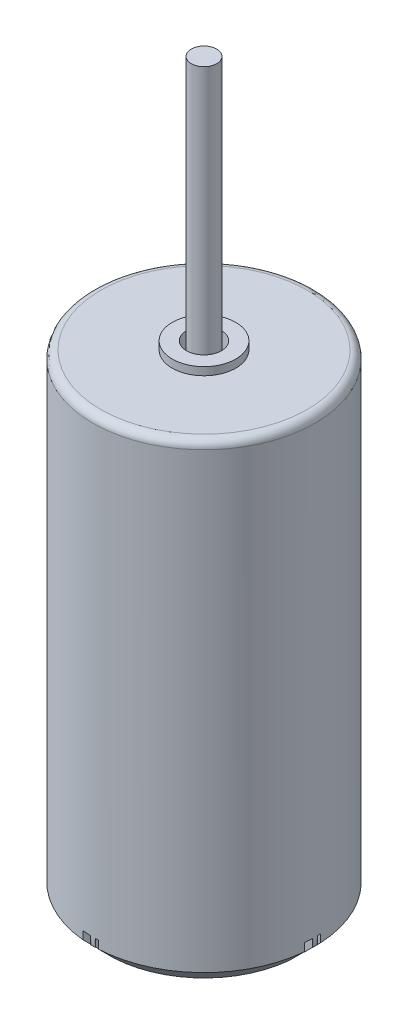
ISO-10303-21;
HEADER;
FILE_DESCRIPTION(('STEP AP214'),'2;1');
FILE_NAME('part.step','',(''),(''),'','','');
FILE_SCHEMA(('AUTOMOTIVE_DESIGN { 1 0 10303 214 1 1 1 1 }'));
ENDSEC;
DATA;
#1=APPLICATION_CONTEXT('core data for automotive mechanical design processes');
#2=APPLICATION_PROTOCOL_DEFINITION('international standard','automotive_design',2000,#1);
#3=PRODUCT_CONTEXT('',#1,'mechanical');
#4=PRODUCT('Part','Part','',(#3));
#5=PRODUCT_RELATED_PRODUCT_CATEGORY('part','',(#4));
#6=PRODUCT_DEFINITION_FORMATION('','',#4);
#7=PRODUCT_DEFINITION_CONTEXT('part definition',#1,'design');
#8=PRODUCT_DEFINITION('design','',#6,#7);
#9=PRODUCT_DEFINITION_SHAPE('','',#8);
#10=(LENGTH_UNIT() NAMED_UNIT(*) SI_UNIT(.MILLI.,.METRE.));
#11=(NAMED_UNIT(*) PLANE_ANGLE_UNIT() SI_UNIT($,.RADIAN.));
#12=(NAMED_UNIT(*) SI_UNIT($,.STERADIAN.) SOLID_ANGLE_UNIT());
#13=UNCERTAINTY_MEASURE_WITH_UNIT(LENGTH_MEASURE(1.E-05),#10,'distance_accuracy_value','');
#14=(GEOMETRIC_REPRESENTATION_CONTEXT(3) GLOBAL_UNCERTAINTY_ASSIGNED_CONTEXT((#13)) GLOBAL_UNIT_ASSIGNED_CONTEXT((#10,
#11,#12)) REPRESENTATION_CONTEXT('',''));
#15=CARTESIAN_POINT('',(0.,0.,0.));
#16=DIRECTION('',(0.,0.,1.));
#17=DIRECTION('',(1.,0.,0.));
#18=AXIS2_PLACEMENT_3D('',#15,#16,#17);
#19=CARTESIAN_POINT('',(0.,0.,0.));
#20=DIRECTION('',(0.,1.,0.));
#21=DIRECTION('',(0.,0.,1.));
#22=AXIS2_PLACEMENT_3D('',#19,#20,#21);
#23=CONICAL_SURFACE('',#22,3.,0.785398163397447);
#24=CARTESIAN_POINT('',(0.17527236331454,-1.11823398874989,1.87358557844425));
#25=CARTESIAN_POINT('',(0.175272363314539,-0.8589461756864,2.13393247003531));
#26=CARTESIAN_POINT('',(0.175272363314538,-0.599509125002639,2.3941305338134));
#27=CARTESIAN_POINT('',(0.175272363314537,-0.0804534282997137,2.91434540840418));
#28=CARTESIAN_POINT('',(0.175272363314536,0.17916521768817,3.17436221924808));
#29=CARTESIAN_POINT('',(0.175272363314534,0.63535489082715,3.63113762261168));
#30=CARTESIAN_POINT('',(0.175272363314533,0.831912080483809,3.82791004320747));
#31=CARTESIAN_POINT('',(0.175272363314532,1.22505439379513,4.22142702032182));
#32=CARTESIAN_POINT('',(0.175272363314531,1.42163951745283,4.41817157683735));
#33=CARTESIAN_POINT('',(0.175272363314531,1.61823398874989,4.61490680008848));
#34=B_SPLINE_CURVE_WITH_KNOTS('',3,(#24,#25,#26,#27,#28,#29,#30,#31,#32,#33),.UNSPECIFIED.,.F.,
.F.,(4,2,2,2,4),(0.,1.10231370844077,2.20462722704108,3.03900546012018,3.87338378422474),.UNSPECIFIED.);
#35=CARTESIAN_POINT('',(0.175272363314536,0.,2.99487555645609));
#36=VERTEX_POINT('',#35);
#37=CARTESIAN_POINT('',(0.175272363314535,0.499999999999999,3.49560861634396));
#38=VERTEX_POINT('',#37);
#39=EDGE_CURVE('E633',#36,#38,#34,.T.);
#40=ORIENTED_EDGE('',*,*,#39,.F.);
#41=CARTESIAN_POINT('',(0.,0.,0.));
#42=DIRECTION('',(0.,-1.,0.));
#43=DIRECTION('',(0.,0.,-1.));
#44=AXIS2_PLACEMENT_3D('',#41,#42,#43);
#45=CIRCLE('',#44,3.);
#46=CARTESIAN_POINT('',(2.98237354500953,0.,0.324727636685453));
#47=VERTEX_POINT('',#46);
#48=EDGE_CURVE('E516',#47,#36,#45,.T.);
#49=ORIENTED_EDGE('',*,*,#48,.F.);
#50=CARTESIAN_POINT('',(4.60680335339131,1.61823398874989,0.324727636685453));
#51=CARTESIAN_POINT('',(4.37777151372005,1.38978566009453,0.324727636685453));
#52=CARTESIAN_POINT('',(4.14871311811422,1.16136388663444,0.324727636685453));
#53=CARTESIAN_POINT('',(3.69045593135217,0.704662018285365,0.324727636685453));
#54=CARTESIAN_POINT('',(3.46125714043768,0.476381923153808,0.324727636685453));
#55=CARTESIAN_POINT('',(3.00263065589192,0.0200507591434697,0.324727636685453));
#56=CARTESIAN_POINT('',(2.77320296182465,-0.208000309297398,0.324727636685453));
#57=CARTESIAN_POINT('',(2.42870895506907,-0.549722189765073,0.324727636685453));
#58=CARTESIAN_POINT('',(2.31381877268379,-0.663570464169604,0.324727636685453));
#59=CARTESIAN_POINT('',(2.08384315728113,-0.89106986508098,0.324727636685453));
#60=CARTESIAN_POINT('',(1.96875772403217,-1.00472099135367,0.324727636685453));
#61=CARTESIAN_POINT('',(1.85353588664176,-1.11823398874989,0.324727636685453));
#62=B_SPLINE_CURVE_WITH_KNOTS('',3,(#50,#51,#52,#53,#54,#55,#56,#57,#58,#59,#60,#61),
.UNSPECIFIED.,.F.,.F.,(4,2,2,2,2,4),(0.,0.970462841139811,1.94092401607463,2.91138704307375,
3.39661942125926,3.88185237537384),.UNSPECIFIED.);
#63=CARTESIAN_POINT('',(3.48490343653489,0.499999999999999,0.324727636685453));
#64=VERTEX_POINT('',#63);
#65=EDGE_CURVE('E511',#64,#47,#62,.T.);
#66=ORIENTED_EDGE('',*,*,#65,.F.);
#67=CARTESIAN_POINT('',(0.,0.499999999999999,0.));
#68=DIRECTION('',(0.,-1.,0.));
#69=DIRECTION('',(0.,0.,-1.));
#70=AXIS2_PLACEMENT_3D('',#67,#68,#69);
#71=CIRCLE('',#70,3.5);
#72=EDGE_CURVE('E512',#38,#64,#71,.F.);
#73=ORIENTED_EDGE('',*,*,#72,.F.);
#74=EDGE_LOOP('',(#40,#49,#66,#73));
#75=FACE_BOUND('',#74,.T.);
#76=ADVANCED_FACE('F47',(#75),#23,.T.);
#77=CARTESIAN_POINT('',(-0.324727636685469,1.61823398874989,4.60680335339131));
#78=CARTESIAN_POINT('',(-0.324727636685469,1.38978566009453,4.37777151372005));
#79=CARTESIAN_POINT('',(-0.324727636685468,1.16136388663443,4.14871311811422));
#80=CARTESIAN_POINT('',(-0.324727636685466,0.704662018285365,3.69045593135217));
#81=CARTESIAN_POINT('',(-0.324727636685465,0.476381923153808,3.46125714043768));
#82=CARTESIAN_POINT('',(-0.324727636685464,0.0200507591434696,3.00263065589192));
#83=CARTESIAN_POINT('',(-0.324727636685463,-0.208000309297398,2.77320296182465));
#84=CARTESIAN_POINT('',(-0.324727636685462,-0.549722189765073,2.42870895506907));
#85=CARTESIAN_POINT('',(-0.324727636685461,-0.663570464169603,2.31381877268379));
#86=CARTESIAN_POINT('',(-0.324727636685461,-0.891069865080979,2.08384315728113));
#87=CARTESIAN_POINT('',(-0.32472763668546,-1.00472099135367,1.96875772403217));
#88=CARTESIAN_POINT('',(-0.32472763668546,-1.11823398874989,1.85353588664176));
#89=B_SPLINE_CURVE_WITH_KNOTS('',3,(#77,#78,#79,#80,#81,#82,#83,#84,#85,#86,#87,#88),
.UNSPECIFIED.,.F.,.F.,(4,2,2,2,2,4),(0.,0.970462841139811,1.94092401607462,2.91138704307375,
3.39661942125926,3.88185237537384),.UNSPECIFIED.);
#90=CARTESIAN_POINT('',(-0.324727636685465,0.499999999999999,3.48490343653489));
#91=VERTEX_POINT('',#90);
#92=CARTESIAN_POINT('',(-0.324727636685464,0.,2.98237354500953));
#93=VERTEX_POINT('',#92);
#94=EDGE_CURVE('E436',#91,#93,#89,.T.);
#95=ORIENTED_EDGE('',*,*,#94,.F.);
#96=CARTESIAN_POINT('',(-3.49560861634396,0.499999999999999,0.175272363314547));
#97=VERTEX_POINT('',#96);
#98=EDGE_CURVE('E506',#97,#91,#71,.F.);
#99=ORIENTED_EDGE('',*,*,#98,.F.);
#100=CARTESIAN_POINT('',(-1.87358557844425,-1.11823398874989,0.175272363314547));
#101=CARTESIAN_POINT('',(-2.13393247003531,-0.8589461756864,0.175272363314547));
#102=CARTESIAN_POINT('',(-2.3941305338134,-0.59950912500264,0.175272363314547));
#103=CARTESIAN_POINT('',(-2.91434540840418,-0.0804534282997134,0.175272363314547));
#104=CARTESIAN_POINT('',(-3.17436221924808,0.17916521768817,0.175272363314547));
#105=CARTESIAN_POINT('',(-3.63113762261168,0.63535489082715,0.175272363314547));
#106=CARTESIAN_POINT('',(-3.82791004320747,0.831912080483809,0.175272363314547));
#107=CARTESIAN_POINT('',(-4.22142702032182,1.22505439379513,0.175272363314547));
#108=CARTESIAN_POINT('',(-4.41817157683735,1.42163951745283,0.175272363314547));
#109=CARTESIAN_POINT('',(-4.61490680008848,1.61823398874989,0.175272363314547));
#110=B_SPLINE_CURVE_WITH_KNOTS('',3,(#100,#101,#102,#103,#104,#105,#106,#107,#108,#109),
.UNSPECIFIED.,.F.,.F.,(4,2,2,2,4),(0.,1.10231370844077,2.20462722704108,3.03900546012018,
3.87338378422474),.UNSPECIFIED.);
#111=CARTESIAN_POINT('',(-2.99487555645609,0.,0.175272363314547));
#112=VERTEX_POINT('',#111);
#113=EDGE_CURVE('E428',#112,#97,#110,.T.);
#114=ORIENTED_EDGE('',*,*,#113,.F.);
#115=EDGE_CURVE('E700',#93,#112,#45,.T.);
#116=ORIENTED_EDGE('',*,*,#115,.F.);
#117=EDGE_LOOP('',(#95,#99,#114,#116));
#118=FACE_BOUND('',#117,.T.);
#119=ADVANCED_FACE('F456',(#118),#23,.T.);
#120=CARTESIAN_POINT('',(-4.60680335339131,1.61823398874989,-0.324727636685453));
#121=CARTESIAN_POINT('',(-4.37777151372005,1.38978566009453,-0.324727636685453));
#122=CARTESIAN_POINT('',(-4.14871311811422,1.16136388663444,-0.324727636685453));
#123=CARTESIAN_POINT('',(-3.69045593135217,0.704662018285365,-0.324727636685453));
#124=CARTESIAN_POINT('',(-3.46125714043768,0.476381923153808,-0.324727636685453));
#125=CARTESIAN_POINT('',(-3.00263065589192,0.0200507591434697,-0.324727636685453));
#126=CARTESIAN_POINT('',(-2.77320296182465,-0.208000309297398,-0.324727636685453));
#127=CARTESIAN_POINT('',(-2.42870895506907,-0.549722189765073,-0.324727636685453));
#128=CARTESIAN_POINT('',(-2.31381877268379,-0.663570464169604,-0.324727636685453));
#129=CARTESIAN_POINT('',(-2.08384315728113,-0.89106986508098,-0.324727636685453));
#130=CARTESIAN_POINT('',(-1.96875772403217,-1.00472099135367,-0.324727636685453));
#131=CARTESIAN_POINT('',(-1.85353588664176,-1.11823398874989,-0.324727636685453));
#132=B_SPLINE_CURVE_WITH_KNOTS('',3,(#120,#121,#122,#123,#124,#125,#126,#127,#128,#129,#130,
#131),.UNSPECIFIED.,.F.,.F.,(4,2,2,2,2,4),(0.,0.970462841139811,1.94092401607463,
2.91138704307375,3.39661942125926,3.88185237537384),.UNSPECIFIED.);
#133=CARTESIAN_POINT('',(-3.48490343653489,0.499999999999999,-0.324727636685453));
#134=VERTEX_POINT('',#133);
#135=CARTESIAN_POINT('',(-2.98237354500953,0.,-0.324727636685453));
#136=VERTEX_POINT('',#135);
#137=EDGE_CURVE('E421',#134,#136,#132,.T.);
#138=ORIENTED_EDGE('',*,*,#137,.F.);
#139=CARTESIAN_POINT('',(-0.17527236331451,0.499999999999999,-3.49560861634396));
#140=VERTEX_POINT('',#139);
#141=EDGE_CURVE('E494',#140,#134,#71,.F.);
#142=ORIENTED_EDGE('',*,*,#141,.F.);
#143=CARTESIAN_POINT('',(-0.175272363314527,-1.11823398874989,-1.87358557844426));
#144=CARTESIAN_POINT('',(-0.175272363314524,-0.8589461756864,-2.13393247003531));
#145=CARTESIAN_POINT('',(-0.175272363314522,-0.59950912500264,-2.3941305338134));
#146=CARTESIAN_POINT('',(-0.175272363314516,-0.0804534282997136,-2.91434540840418));
#147=CARTESIAN_POINT('',(-0.175272363314514,0.17916521768817,-3.17436221924809));
#148=CARTESIAN_POINT('',(-0.175272363314509,0.63535489082715,-3.63113762261168));
#149=CARTESIAN_POINT('',(-0.175272363314507,0.83191208048381,-3.82791004320747));
#150=CARTESIAN_POINT('',(-0.175272363314503,1.22505439379513,-4.22142702032183));
#151=CARTESIAN_POINT('',(-0.1752723633145,1.42163951745283,-4.41817157683735));
#152=CARTESIAN_POINT('',(-0.175272363314498,1.61823398874989,-4.61490680008848));
#153=B_SPLINE_CURVE_WITH_KNOTS('',3,(#143,#144,#145,#146,#147,#148,#149,#150,#151,#152),
.UNSPECIFIED.,.F.,.F.,(4,2,2,2,4),(0.,1.10231370844077,2.20462722704108,3.03900546012018,
3.87338378422474),.UNSPECIFIED.);
#154=CARTESIAN_POINT('',(-0.175272363314515,0.,-2.99487555645609));
#155=VERTEX_POINT('',#154);
#156=EDGE_CURVE('E406',#155,#140,#153,.T.);
#157=ORIENTED_EDGE('',*,*,#156,.F.);
#158=EDGE_CURVE('E496',#136,#155,#45,.T.);
#159=ORIENTED_EDGE('',*,*,#158,.F.);
#160=EDGE_LOOP('',(#138,#142,#157,#159));
#161=FACE_BOUND('',#160,.T.);
#162=ADVANCED_FACE('F462',(#161),#23,.T.);
#163=CARTESIAN_POINT('',(3.5,0.,0.));
#164=DIRECTION('',(0.,-1.,0.));
#165=DIRECTION('',(0.,0.,-1.));
#166=AXIS2_PLACEMENT_3D('',#163,#164,#165);
#167=PLANE('',#166);
#168=DIRECTION('',(0.,0.,1.));
#169=VECTOR('',#168,1.);
#170=CARTESIAN_POINT('',(0.175272363314538,0.,2.49906915230633));
#171=LINE('',#170,#169);
#172=CARTESIAN_POINT('',(0.175272363314538,0.,2.49906915230633));
#173=VERTEX_POINT('',#172);
#174=EDGE_CURVE('E276',#173,#36,#171,.T.);
#175=ORIENTED_EDGE('',*,*,#174,.F.);
#176=DIRECTION('',(1.,0.,0.));
#177=VECTOR('',#176,1.);
#178=CARTESIAN_POINT('',(-0.324727636685462,0.,2.49906915230633));
#179=LINE('',#178,#177);
#180=CARTESIAN_POINT('',(-0.324727636685462,0.,2.49906915230633));
#181=VERTEX_POINT('',#180);
#182=EDGE_CURVE('E272',#181,#173,#179,.T.);
#183=ORIENTED_EDGE('',*,*,#182,.F.);
#184=DIRECTION('',(0.,0.,-1.));
#185=VECTOR('',#184,1.);
#186=CARTESIAN_POINT('',(-0.324727636685462,0.,2.49906915230633));
#187=LINE('',#186,#185);
#188=EDGE_CURVE('E255',#93,#181,#187,.T.);
#189=ORIENTED_EDGE('',*,*,#188,.F.);
#190=ORIENTED_EDGE('',*,*,#115,.T.);
#191=DIRECTION('',(-1.,0.,0.));
#192=VECTOR('',#191,1.);
#193=CARTESIAN_POINT('',(-2.49906915230633,0.,0.175272363314547));
#194=LINE('',#193,#192);
#195=CARTESIAN_POINT('',(-2.49906915230633,0.,0.175272363314547));
#196=VERTEX_POINT('',#195);
#197=EDGE_CURVE('E287',#196,#112,#194,.T.);
#198=ORIENTED_EDGE('',*,*,#197,.F.);
#199=DIRECTION('',(0.,0.,1.));
#200=VECTOR('',#199,1.);
#201=CARTESIAN_POINT('',(-2.49906915230633,0.,-0.324727636685453));
#202=LINE('',#201,#200);
#203=CARTESIAN_POINT('',(-2.49906915230633,0.,-0.324727636685453));
#204=VERTEX_POINT('',#203);
#205=EDGE_CURVE('E302',#204,#196,#202,.T.);
#206=ORIENTED_EDGE('',*,*,#205,.F.);
#207=DIRECTION('',(1.,0.,0.));
#208=VECTOR('',#207,1.);
#209=CARTESIAN_POINT('',(-2.49906915230633,0.,-0.324727636685453));
#210=LINE('',#209,#208);
#211=EDGE_CURVE('E299',#136,#204,#210,.T.);
#212=ORIENTED_EDGE('',*,*,#211,.F.);
#213=ORIENTED_EDGE('',*,*,#158,.T.);
#214=DIRECTION('',(0.,0.,-1.));
#215=VECTOR('',#214,1.);
#216=CARTESIAN_POINT('',(-0.175272363314521,0.,-2.49906915230633));
#217=LINE('',#216,#215);
#218=CARTESIAN_POINT('',(-0.175272363314521,0.,-2.49906915230633));
#219=VERTEX_POINT('',#218);
#220=EDGE_CURVE('E319',#219,#155,#217,.T.);
#221=ORIENTED_EDGE('',*,*,#220,.F.);
#222=DIRECTION('',(-1.,0.,0.));
#223=VECTOR('',#222,1.);
#224=CARTESIAN_POINT('',(0.324727636685479,0.,-2.49906915230633));
#225=LINE('',#224,#223);
#226=CARTESIAN_POINT('',(0.324727636685479,0.,-2.49906915230633));
#227=VERTEX_POINT('',#226);
#228=EDGE_CURVE('E334',#227,#219,#225,.T.);
#229=ORIENTED_EDGE('',*,*,#228,.F.);
#230=DIRECTION('',(0.,0.,1.));
#231=VECTOR('',#230,1.);
#232=CARTESIAN_POINT('',(0.324727636685479,0.,-2.49906915230633));
#233=LINE('',#232,#231);
#234=CARTESIAN_POINT('',(0.324727636685484,0.,-2.98237354500952));
#235=VERTEX_POINT('',#234);
#236=EDGE_CURVE('E331',#235,#227,#233,.T.);
#237=ORIENTED_EDGE('',*,*,#236,.F.);
#238=CARTESIAN_POINT('',(2.99487555645609,0.,-0.175272363314547));
#239=VERTEX_POINT('',#238);
#240=EDGE_CURVE('E688',#235,#239,#45,.T.);
#241=ORIENTED_EDGE('',*,*,#240,.T.);
#242=DIRECTION('',(1.,0.,0.));
#243=VECTOR('',#242,1.);
#244=CARTESIAN_POINT('',(2.49906915230633,0.,-0.175272363314547));
#245=LINE('',#244,#243);
#246=CARTESIAN_POINT('',(2.49906915230633,0.,-0.175272363314547));
#247=VERTEX_POINT('',#246);
#248=EDGE_CURVE('E577',#247,#239,#245,.T.);
#249=ORIENTED_EDGE('',*,*,#248,.F.);
#250=DIRECTION('',(0.,0.,-1.));
#251=VECTOR('',#250,1.);
#252=CARTESIAN_POINT('',(2.49906915230633,0.,0.324727636685453));
#253=LINE('',#252,#251);
#254=CARTESIAN_POINT('',(2.49906915230633,0.,0.324727636685453));
#255=VERTEX_POINT('',#254);
#256=EDGE_CURVE('E582',#255,#247,#253,.T.);
#257=ORIENTED_EDGE('',*,*,#256,.F.);
#258=DIRECTION('',(-1.,0.,0.));
#259=VECTOR('',#258,1.);
#260=CARTESIAN_POINT('',(2.49906915230633,0.,0.324727636685453));
#261=LINE('',#260,#259);
#262=EDGE_CURVE('E586',#47,#255,#261,.T.);
#263=ORIENTED_EDGE('',*,*,#262,.F.);
#264=ORIENTED_EDGE('',*,*,#48,.T.);
#265=EDGE_LOOP('',(#175,#183,#189,#190,#198,#206,#212,#213,#221,#229,#237,#241,#249,#257,#263,#264));
#266=FACE_BOUND('',#265,.T.);
#267=ADVANCED_FACE('F482',(#266),#167,.T.);
#268=CARTESIAN_POINT('',(0.,23.,0.));
#269=DIRECTION('',(0.,1.,0.));
#270=DIRECTION('',(0.,0.,1.));
#271=AXIS2_PLACEMENT_3D('',#268,#269,#270);
#272=PLANE('',#271);
#273=CARTESIAN_POINT('',(0.,23.,0.));
#274=DIRECTION('',(0.,-1.,0.));
#275=DIRECTION('',(0.,0.,-1.));
#276=AXIS2_PLACEMENT_3D('',#273,#274,#275);
#277=CIRCLE('',#276,0.4);
#278=CARTESIAN_POINT('',(0.,23.,-0.4));
#279=VERTEX_POINT('',#278);
#280=EDGE_CURVE('E747',#279,#279,#277,.T.);
#281=ORIENTED_EDGE('',*,*,#280,.F.);
#282=EDGE_LOOP('',(#281));
#283=FACE_BOUND('',#282,.T.);
#284=ADVANCED_FACE('F487',(#283),#272,.T.);
#285=CARTESIAN_POINT('',(0.,0.,0.));
#286=DIRECTION('',(0.,-1.,0.));
#287=DIRECTION('',(0.,0.,-1.));
#288=AXIS2_PLACEMENT_3D('',#285,#286,#287);
#289=CYLINDRICAL_SURFACE('',#288,0.400000000000001);
#290=ORIENTED_EDGE('',*,*,#280,.T.);
#291=EDGE_LOOP('',(#290));
#292=FACE_BOUND('',#291,.T.);
#293=CARTESIAN_POINT('',(0.,14.75,0.));
#294=DIRECTION('',(0.,-1.,0.));
#295=DIRECTION('',(0.,0.,-1.));
#296=AXIS2_PLACEMENT_3D('',#293,#294,#295);
#297=CIRCLE('',#296,0.400000000000001);
#298=CARTESIAN_POINT('',(0.,14.75,-0.400000000000001));
#299=VERTEX_POINT('',#298);
#300=EDGE_CURVE('E743',#299,#299,#297,.T.);
#301=ORIENTED_EDGE('',*,*,#300,.F.);
#302=EDGE_LOOP('',(#301));
#303=FACE_BOUND('',#302,.T.);
#304=ADVANCED_FACE('F778',(#292,#303),#289,.T.);
#305=CARTESIAN_POINT('',(0.400000000000001,14.75,0.));
#306=DIRECTION('',(0.,1.,0.));
#307=DIRECTION('',(0.,0.,1.));
#308=AXIS2_PLACEMENT_3D('',#305,#306,#307);
#309=PLANE('',#308);
#310=ORIENTED_EDGE('',*,*,#300,.T.);
#311=EDGE_LOOP('',(#310));
#312=FACE_BOUND('',#311,.T.);
#313=CARTESIAN_POINT('',(0.,14.75,0.));
#314=DIRECTION('',(0.,-1.,0.));
#315=DIRECTION('',(0.,0.,-1.));
#316=AXIS2_PLACEMENT_3D('',#313,#314,#315);
#317=CIRCLE('',#316,0.550000000000001);
#318=CARTESIAN_POINT('',(0.,14.75,-0.550000000000001));
#319=VERTEX_POINT('',#318);
#320=EDGE_CURVE('E739',#319,#319,#317,.T.);
#321=ORIENTED_EDGE('',*,*,#320,.F.);
#322=EDGE_LOOP('',(#321));
#323=FACE_BOUND('',#322,.T.);
#324=ADVANCED_FACE('F774',(#312,#323),#309,.T.);
#325=CARTESIAN_POINT('',(0.,0.,0.));
#326=DIRECTION('',(0.,-1.,0.));
#327=DIRECTION('',(0.,0.,-1.));
#328=AXIS2_PLACEMENT_3D('',#325,#326,#327);
#329=CYLINDRICAL_SURFACE('',#328,0.550000000000001);
#330=ORIENTED_EDGE('',*,*,#320,.T.);
#331=EDGE_LOOP('',(#330));
#332=FACE_BOUND('',#331,.T.);
#333=CARTESIAN_POINT('',(0.,15.25,0.));
#334=DIRECTION('',(0.,-1.,0.));
#335=DIRECTION('',(0.,0.,-1.));
#336=AXIS2_PLACEMENT_3D('',#333,#334,#335);
#337=CIRCLE('',#336,0.550000000000001);
#338=CARTESIAN_POINT('',(0.,15.25,-0.550000000000001));
#339=VERTEX_POINT('',#338);
#340=EDGE_CURVE('E733',#339,#339,#337,.T.);
#341=ORIENTED_EDGE('',*,*,#340,.F.);
#342=EDGE_LOOP('',(#341));
#343=FACE_BOUND('',#342,.T.);
#344=ADVANCED_FACE('F770',(#332,#343),#329,.F.);
#345=CARTESIAN_POINT('',(0.550000000000001,15.25,0.));
#346=DIRECTION('',(0.,1.,0.));
#347=DIRECTION('',(0.,0.,1.));
#348=AXIS2_PLACEMENT_3D('',#345,#346,#347);
#349=PLANE('',#348);
#350=ORIENTED_EDGE('',*,*,#340,.T.);
#351=EDGE_LOOP('',(#350));
#352=FACE_BOUND('',#351,.T.);
#353=CARTESIAN_POINT('',(0.,15.25,0.));
#354=DIRECTION('',(0.,-1.,0.));
#355=DIRECTION('',(0.,0.,-1.));
#356=AXIS2_PLACEMENT_3D('',#353,#354,#355);
#357=CIRCLE('',#356,1.);
#358=CARTESIAN_POINT('',(0.,15.25,-1.));
#359=VERTEX_POINT('',#358);
#360=EDGE_CURVE('E728',#359,#359,#357,.T.);
#361=ORIENTED_EDGE('',*,*,#360,.F.);
#362=EDGE_LOOP('',(#361));
#363=FACE_BOUND('',#362,.T.);
#364=ADVANCED_FACE('F764',(#352,#363),#349,.T.);
#365=CARTESIAN_POINT('',(0.,0.,0.));
#366=DIRECTION('',(0.,-1.,0.));
#367=DIRECTION('',(0.,0.,-1.));
#368=AXIS2_PLACEMENT_3D('',#365,#366,#367);
#369=CYLINDRICAL_SURFACE('',#368,1.);
#370=ORIENTED_EDGE('',*,*,#360,.T.);
#371=EDGE_LOOP('',(#370));
#372=FACE_BOUND('',#371,.T.);
#373=CARTESIAN_POINT('',(0.,15.,0.));
#374=DIRECTION('',(0.,-1.,0.));
#375=DIRECTION('',(0.,0.,-1.));
#376=AXIS2_PLACEMENT_3D('',#373,#374,#375);
#377=CIRCLE('',#376,1.);
#378=CARTESIAN_POINT('',(0.,15.,-1.));
#379=VERTEX_POINT('',#378);
#380=EDGE_CURVE('E725',#379,#379,#377,.T.);
#381=ORIENTED_EDGE('',*,*,#380,.F.);
#382=EDGE_LOOP('',(#381));
#383=FACE_BOUND('',#382,.T.);
#384=ADVANCED_FACE('F759',(#372,#383),#369,.T.);
#385=CARTESIAN_POINT('',(1.,15.,0.));
#386=DIRECTION('',(0.,1.,0.));
#387=DIRECTION('',(0.,0.,1.));
#388=AXIS2_PLACEMENT_3D('',#385,#386,#387);
#389=PLANE('',#388);
#390=CARTESIAN_POINT('',(0.,15.,0.));
#391=DIRECTION('',(0.,1.,0.));
#392=DIRECTION('',(0.,0.,1.));
#393=AXIS2_PLACEMENT_3D('',#390,#391,#392);
#394=CIRCLE('',#393,3.25);
#395=CARTESIAN_POINT('',(0.,15.,3.25));
#396=VERTEX_POINT('',#395);
#397=EDGE_CURVE('E704',#396,#396,#394,.T.);
#398=ORIENTED_EDGE('',*,*,#397,.T.);
#399=EDGE_LOOP('',(#398));
#400=FACE_BOUND('',#399,.T.);
#401=ORIENTED_EDGE('',*,*,#380,.T.);
#402=EDGE_LOOP('',(#401));
#403=FACE_BOUND('',#402,.T.);
#404=ADVANCED_FACE('F755',(#400,#403),#389,.T.);
#405=CARTESIAN_POINT('',(0.,0.,0.));
#406=DIRECTION('',(0.,-1.,0.));
#407=DIRECTION('',(0.,0.,-1.));
#408=AXIS2_PLACEMENT_3D('',#405,#406,#407);
#409=CYLINDRICAL_SURFACE('',#408,3.5);
#410=DIRECTION('',(0.,-1.,0.));
#411=VECTOR('',#410,1.);
#412=CARTESIAN_POINT('',(-0.0807159673066351,0.,3.49906915230633));
#413=LINE('',#412,#411);
#414=CARTESIAN_POINT('',(-0.0807159673066351,0.499999999999998,3.49906915230633));
#415=VERTEX_POINT('',#414);
#416=CARTESIAN_POINT('',(-0.0807159673066351,0.75,3.49906915230633));
#417=VERTEX_POINT('',#416);
#418=EDGE_CURVE('E589',#415,#417,#413,.F.);
#419=ORIENTED_EDGE('',*,*,#418,.F.);
#420=CARTESIAN_POINT('',(0.,0.499999999999999,0.));
#421=DIRECTION('',(0.,1.,0.));
#422=DIRECTION('',(-0.0230617049447523,0.,0.999734043516095));
#423=AXIS2_PLACEMENT_3D('',#420,#421,#422);
#424=CIRCLE('',#423,3.5);
#425=CARTESIAN_POINT('',(0.0807159673066154,0.49999999999973,3.49906915230633));
#426=VERTEX_POINT('',#425);
#427=EDGE_CURVE('E632',#415,#426,#424,.T.);
#428=ORIENTED_EDGE('',*,*,#427,.T.);
#429=DIRECTION('',(0.,-1.,0.));
#430=VECTOR('',#429,1.);
#431=CARTESIAN_POINT('',(0.0807159673066107,0.,3.49906915230633));
#432=LINE('',#431,#430);
#433=CARTESIAN_POINT('',(0.0807159673066107,0.75,3.49906915230633));
#434=VERTEX_POINT('',#433);
#435=EDGE_CURVE('E606',#434,#426,#432,.T.);
#436=ORIENTED_EDGE('',*,*,#435,.F.);
#437=CARTESIAN_POINT('',(0.,0.75,0.));
#438=DIRECTION('',(0.,-1.,0.));
#439=DIRECTION('',(0.,0.,-1.));
#440=AXIS2_PLACEMENT_3D('',#437,#438,#439);
#441=CIRCLE('',#440,3.5);
#442=CARTESIAN_POINT('',(0.175272363314535,0.75,3.49560861634396));
#443=VERTEX_POINT('',#442);
#444=EDGE_CURVE('E61',#434,#443,#441,.F.);
#445=ORIENTED_EDGE('',*,*,#444,.T.);
#446=DIRECTION('',(0.,-1.,0.));
#447=VECTOR('',#446,1.);
#448=CARTESIAN_POINT('',(0.175272363314535,0.,3.49560861634396));
#449=LINE('',#448,#447);
#450=EDGE_CURVE('E715',#38,#443,#449,.F.);
#451=ORIENTED_EDGE('',*,*,#450,.F.);
#452=ORIENTED_EDGE('',*,*,#72,.T.);
#453=DIRECTION('',(0.,-1.,0.));
#454=VECTOR('',#453,1.);
#455=CARTESIAN_POINT('',(3.48490343653489,0.,0.324727636685453));
#456=LINE('',#455,#454);
#457=CARTESIAN_POINT('',(3.48490343653489,0.75,0.324727636685453));
#458=VERTEX_POINT('',#457);
#459=EDGE_CURVE('E565',#458,#64,#456,.T.);
#460=ORIENTED_EDGE('',*,*,#459,.F.);
#461=CARTESIAN_POINT('',(0.,0.75,0.));
#462=DIRECTION('',(0.,-1.,0.));
#463=DIRECTION('',(0.,0.,-1.));
#464=AXIS2_PLACEMENT_3D('',#461,#462,#463);
#465=CIRCLE('',#464,3.5);
#466=CARTESIAN_POINT('',(3.49906915230633,0.75,0.0807159673066229));
#467=VERTEX_POINT('',#466);
#468=EDGE_CURVE('E671',#458,#467,#465,.F.);
#469=ORIENTED_EDGE('',*,*,#468,.T.);
#470=DIRECTION('',(0.,-1.,0.));
#471=VECTOR('',#470,1.);
#472=CARTESIAN_POINT('',(3.49906915230633,0.,0.0807159673066229));
#473=LINE('',#472,#471);
#474=CARTESIAN_POINT('',(3.49906915230633,0.499999999999999,0.0807159673066229));
#475=VERTEX_POINT('',#474);
#476=EDGE_CURVE('E557',#475,#467,#473,.F.);
#477=ORIENTED_EDGE('',*,*,#476,.F.);
#478=CARTESIAN_POINT('',(0.,0.499999999999999,0.));
#479=DIRECTION('',(0.,1.,0.));
#480=DIRECTION('',(0.999734043516095,0.,0.0230617049447495));
#481=AXIS2_PLACEMENT_3D('',#478,#479,#480);
#482=CIRCLE('',#481,3.5);
#483=CARTESIAN_POINT('',(3.49906915230633,0.49999999999973,-0.0807159673066276));
#484=VERTEX_POINT('',#483);
#485=EDGE_CURVE('E677',#475,#484,#482,.T.);
#486=ORIENTED_EDGE('',*,*,#485,.T.);
#487=DIRECTION('',(0.,-1.,0.));
#488=VECTOR('',#487,1.);
#489=CARTESIAN_POINT('',(3.49906915230633,0.,-0.0807159673066229));
#490=LINE('',#489,#488);
#491=CARTESIAN_POINT('',(3.49906915230633,0.75,-0.0807159673066229));
#492=VERTEX_POINT('',#491);
#493=EDGE_CURVE('E548',#492,#484,#490,.T.);
#494=ORIENTED_EDGE('',*,*,#493,.F.);
#495=CARTESIAN_POINT('',(3.49560861634396,0.75,-0.175272363314547));
#496=VERTEX_POINT('',#495);
#497=EDGE_CURVE('E674',#492,#496,#465,.F.);
#498=ORIENTED_EDGE('',*,*,#497,.T.);
#499=DIRECTION('',(0.,-1.,0.));
#500=VECTOR('',#499,1.);
#501=CARTESIAN_POINT('',(3.49560861634396,0.,-0.175272363314547));
#502=LINE('',#501,#500);
#503=CARTESIAN_POINT('',(3.49560861634396,0.499999999999999,-0.175272363314547));
#504=VERTEX_POINT('',#503);
#505=EDGE_CURVE('E558',#504,#496,#502,.F.);
#506=ORIENTED_EDGE('',*,*,#505,.F.);
#507=CARTESIAN_POINT('',(0.32472763668549,0.499999999999999,-3.48490343653489));
#508=VERTEX_POINT('',#507);
#509=EDGE_CURVE('E505',#504,#508,#71,.F.);
#510=ORIENTED_EDGE('',*,*,#509,.T.);
#511=DIRECTION('',(0.,-1.,0.));
#512=VECTOR('',#511,1.);
#513=CARTESIAN_POINT('',(0.32472763668549,0.,-3.48490343653489));
#514=LINE('',#513,#512);
#515=CARTESIAN_POINT('',(0.32472763668549,0.75,-3.48490343653489));
#516=VERTEX_POINT('',#515);
#517=EDGE_CURVE('E280',#516,#508,#514,.T.);
#518=ORIENTED_EDGE('',*,*,#517,.F.);
#519=CARTESIAN_POINT('',(0.,0.75,0.));
#520=DIRECTION('',(0.,-1.,0.));
#521=DIRECTION('',(0.,0.,-1.));
#522=AXIS2_PLACEMENT_3D('',#519,#520,#521);
#523=CIRCLE('',#522,3.5);
#524=CARTESIAN_POINT('',(0.0807159673066595,0.75,-3.49906915230633));
#525=VERTEX_POINT('',#524);
#526=EDGE_CURVE('E621',#516,#525,#523,.F.);
#527=ORIENTED_EDGE('',*,*,#526,.T.);
#528=DIRECTION('',(0.,-1.,0.));
#529=VECTOR('',#528,1.);
#530=CARTESIAN_POINT('',(0.0807159673066595,0.,-3.49906915230633));
#531=LINE('',#530,#529);
#532=CARTESIAN_POINT('',(0.0807159673066595,0.499999999999999,-3.49906915230633));
#533=VERTEX_POINT('',#532);
#534=EDGE_CURVE('E359',#533,#525,#531,.F.);
#535=ORIENTED_EDGE('',*,*,#534,.F.);
#536=CARTESIAN_POINT('',(0.,0.499999999999999,0.));
#537=DIRECTION('',(0.,1.,0.));
#538=DIRECTION('',(0.0230617049447595,0.,-0.999734043516095));
#539=AXIS2_PLACEMENT_3D('',#536,#537,#538);
#540=CIRCLE('',#539,3.5);
#541=CARTESIAN_POINT('',(-0.080715967306591,0.49999999999973,-3.49906915230633));
#542=VERTEX_POINT('',#541);
#543=EDGE_CURVE('E414',#533,#542,#540,.T.);
#544=ORIENTED_EDGE('',*,*,#543,.T.);
#545=DIRECTION('',(0.,-1.,0.));
#546=VECTOR('',#545,1.);
#547=CARTESIAN_POINT('',(-0.0807159673065862,0.,-3.49906915230633));
#548=LINE('',#547,#546);
#549=CARTESIAN_POINT('',(-0.0807159673065862,0.75,-3.49906915230633));
#550=VERTEX_POINT('',#549);
#551=EDGE_CURVE('E350',#550,#542,#548,.T.);
#552=ORIENTED_EDGE('',*,*,#551,.F.);
#553=CARTESIAN_POINT('',(-0.17527236331451,0.75,-3.49560861634396));
#554=VERTEX_POINT('',#553);
#555=EDGE_CURVE('E625',#550,#554,#523,.F.);
#556=ORIENTED_EDGE('',*,*,#555,.T.);
#557=DIRECTION('',(0.,-1.,0.));
#558=VECTOR('',#557,1.);
#559=CARTESIAN_POINT('',(-0.17527236331451,0.,-3.49560861634396));
#560=LINE('',#559,#558);
#561=EDGE_CURVE('E347',#140,#554,#560,.F.);
#562=ORIENTED_EDGE('',*,*,#561,.F.);
#563=ORIENTED_EDGE('',*,*,#141,.T.);
#564=DIRECTION('',(0.,-1.,0.));
#565=VECTOR('',#564,1.);
#566=CARTESIAN_POINT('',(-3.48490343653489,0.,-0.324727636685453));
#567=LINE('',#566,#565);
#568=CARTESIAN_POINT('',(-3.48490343653489,0.75,-0.324727636685453));
#569=VERTEX_POINT('',#568);
#570=EDGE_CURVE('E77',#569,#134,#567,.T.);
#571=ORIENTED_EDGE('',*,*,#570,.F.);
#572=CARTESIAN_POINT('',(0.,0.75,0.));
#573=DIRECTION('',(0.,-1.,0.));
#574=DIRECTION('',(0.,0.,-1.));
#575=AXIS2_PLACEMENT_3D('',#572,#573,#574);
#576=CIRCLE('',#575,3.5);
#577=CARTESIAN_POINT('',(-3.49906915230633,0.75,-0.0807159673066229));
#578=VERTEX_POINT('',#577);
#579=EDGE_CURVE('E630',#569,#578,#576,.F.);
#580=ORIENTED_EDGE('',*,*,#579,.T.);
#581=DIRECTION('',(0.,-1.,0.));
#582=VECTOR('',#581,1.);
#583=CARTESIAN_POINT('',(-3.49906915230633,0.,-0.0807159673066229));
#584=LINE('',#583,#582);
#585=CARTESIAN_POINT('',(-3.49906915230633,0.499999999999999,-0.0807159673066229));
#586=VERTEX_POINT('',#585);
#587=EDGE_CURVE('E1004',#586,#578,#584,.F.);
#588=ORIENTED_EDGE('',*,*,#587,.F.);
#589=CARTESIAN_POINT('',(0.,0.499999999999999,0.));
#590=DIRECTION('',(0.,1.,0.));
#591=DIRECTION('',(-0.999734043516095,0.,-0.0230617049447496));
#592=AXIS2_PLACEMENT_3D('',#589,#590,#591);
#593=CIRCLE('',#592,3.5);
#594=CARTESIAN_POINT('',(-3.49906915230633,0.49999999999973,0.0807159673066276));
#595=VERTEX_POINT('',#594);
#596=EDGE_CURVE('E369',#586,#595,#593,.T.);
#597=ORIENTED_EDGE('',*,*,#596,.T.);
#598=DIRECTION('',(0.,-1.,0.));
#599=VECTOR('',#598,1.);
#600=CARTESIAN_POINT('',(-3.49906915230633,0.,0.0807159673066229));
#601=LINE('',#600,#599);
#602=CARTESIAN_POINT('',(-3.49906915230633,0.75,0.0807159673066229));
#603=VERTEX_POINT('',#602);
#604=EDGE_CURVE('E375',#603,#595,#601,.T.);
#605=ORIENTED_EDGE('',*,*,#604,.F.);
#606=CARTESIAN_POINT('',(-3.49560861634396,0.75,0.175272363314547));
#607=VERTEX_POINT('',#606);
#608=EDGE_CURVE('E624',#603,#607,#576,.F.);
#609=ORIENTED_EDGE('',*,*,#608,.T.);
#610=DIRECTION('',(0.,-1.,0.));
#611=VECTOR('',#610,1.);
#612=CARTESIAN_POINT('',(-3.49560861634396,0.,0.175272363314547));
#613=LINE('',#612,#611);
#614=EDGE_CURVE('E1018',#97,#607,#613,.F.);
#615=ORIENTED_EDGE('',*,*,#614,.F.);
#616=ORIENTED_EDGE('',*,*,#98,.T.);
#617=DIRECTION('',(0.,-1.,0.));
#618=VECTOR('',#617,1.);
#619=CARTESIAN_POINT('',(-0.324727636685465,0.,3.48490343653489));
#620=LINE('',#619,#618);
#621=CARTESIAN_POINT('',(-0.324727636685465,0.75,3.48490343653489));
#622=VERTEX_POINT('',#621);
#623=EDGE_CURVE('E69',#622,#91,#620,.T.);
#624=ORIENTED_EDGE('',*,*,#623,.F.);
#625=EDGE_CURVE('E11',#622,#417,#441,.F.);
#626=ORIENTED_EDGE('',*,*,#625,.T.);
#627=EDGE_LOOP('',(#419,#428,#436,#445,#451,#452,#460,#469,#477,#486,#494,#498,#506,#510,#518,
#527,#535,#544,#552,#556,#562,#563,#571,#580,#588,#597,#605,#609,#615,#616,#624,#626));
#628=FACE_BOUND('',#627,.T.);
#629=CARTESIAN_POINT('',(0.,14.75,0.));
#630=DIRECTION('',(0.,1.,0.));
#631=DIRECTION('',(0.,0.,1.));
#632=AXIS2_PLACEMENT_3D('',#629,#630,#631);
#633=CIRCLE('',#632,3.5);
#634=CARTESIAN_POINT('',(0.,14.75,3.5));
#635=VERTEX_POINT('',#634);
#636=EDGE_CURVE('E707',#635,#635,#633,.F.);
#637=ORIENTED_EDGE('',*,*,#636,.T.);
#638=EDGE_LOOP('',(#637));
#639=FACE_BOUND('',#638,.T.);
#640=ADVANCED_FACE('F478',(#628,#639),#409,.T.);
#641=CARTESIAN_POINT('',(0.,14.75,0.));
#642=DIRECTION('',(0.,1.,0.));
#643=DIRECTION('',(0.,0.,1.));
#644=AXIS2_PLACEMENT_3D('',#641,#642,#643);
#645=TOROIDAL_SURFACE('',#644,3.25,0.25);
#646=ORIENTED_EDGE('',*,*,#397,.F.);
#647=EDGE_LOOP('',(#646));
#648=FACE_BOUND('',#647,.T.);
#649=ORIENTED_EDGE('',*,*,#636,.F.);
#650=EDGE_LOOP('',(#649));
#651=FACE_BOUND('',#650,.T.);
#652=ADVANCED_FACE('F467',(#648,#651),#645,.T.);
#653=CARTESIAN_POINT('',(0.324727636685501,1.61823398874989,-4.6068033533913));
#654=CARTESIAN_POINT('',(0.324727636685499,1.38978566009453,-4.37777151372004));
#655=CARTESIAN_POINT('',(0.324727636685497,1.16136388663444,-4.14871311811422));
#656=CARTESIAN_POINT('',(0.324727636685492,0.704662018285364,-3.69045593135217));
#657=CARTESIAN_POINT('',(0.324727636685489,0.476381923153808,-3.46125714043767));
#658=CARTESIAN_POINT('',(0.324727636685485,0.0200507591434693,-3.00263065589192));
#659=CARTESIAN_POINT('',(0.324727636685482,-0.208000309297398,-2.77320296182465));
#660=CARTESIAN_POINT('',(0.324727636685479,-0.549722189765074,-2.42870895506906));
#661=CARTESIAN_POINT('',(0.324727636685477,-0.663570464169604,-2.31381877268378));
#662=CARTESIAN_POINT('',(0.324727636685475,-0.89106986508098,-2.08384315728112));
#663=CARTESIAN_POINT('',(0.324727636685474,-1.00472099135367,-1.96875772403216));
#664=CARTESIAN_POINT('',(0.324727636685473,-1.11823398874989,-1.85353588664175));
#665=B_SPLINE_CURVE_WITH_KNOTS('',3,(#653,#654,#655,#656,#657,#658,#659,#660,#661,#662,#663,
#664),.UNSPECIFIED.,.F.,.F.,(4,2,2,2,2,4),(0.,0.970462841139812,1.94092401607463,
2.91138704307375,3.39661942125926,3.88185237537385),.UNSPECIFIED.);
#666=EDGE_CURVE('E415',#508,#235,#665,.T.);
#667=ORIENTED_EDGE('',*,*,#666,.F.);
#668=ORIENTED_EDGE('',*,*,#509,.F.);
#669=CARTESIAN_POINT('',(1.87358557844425,-1.11823398874989,-0.175272363314547));
#670=CARTESIAN_POINT('',(2.13393247003531,-0.8589461756864,-0.175272363314547));
#671=CARTESIAN_POINT('',(2.3941305338134,-0.59950912500264,-0.175272363314547));
#672=CARTESIAN_POINT('',(2.91434540840418,-0.0804534282997132,-0.175272363314547));
#673=CARTESIAN_POINT('',(3.17436221924808,0.179165217688171,-0.175272363314547));
#674=CARTESIAN_POINT('',(3.63113762261168,0.63535489082715,-0.175272363314547));
#675=CARTESIAN_POINT('',(3.82791004320747,0.83191208048381,-0.175272363314547));
#676=CARTESIAN_POINT('',(4.22142702032182,1.22505439379513,-0.175272363314547));
#677=CARTESIAN_POINT('',(4.41817157683735,1.42163951745283,-0.175272363314547));
#678=CARTESIAN_POINT('',(4.61490680008848,1.61823398874989,-0.175272363314547));
#679=B_SPLINE_CURVE_WITH_KNOTS('',3,(#669,#670,#671,#672,#673,#674,#675,#676,#677,#678),
.UNSPECIFIED.,.F.,.F.,(4,2,2,2,4),(0.,1.10231370844077,2.20462722704108,3.03900546012018,
3.87338378422474),.UNSPECIFIED.);
#680=EDGE_CURVE('E525',#239,#504,#679,.T.);
#681=ORIENTED_EDGE('',*,*,#680,.F.);
#682=ORIENTED_EDGE('',*,*,#240,.F.);
#683=EDGE_LOOP('',(#667,#668,#681,#682));
#684=FACE_BOUND('',#683,.T.);
#685=ADVANCED_FACE('F50',(#684),#23,.T.);
#686=CARTESIAN_POINT('',(3.49906915230633,0.75,0.324727636685453));
#687=DIRECTION('',(1.,0.,0.));
#688=DIRECTION('',(0.,0.,-1.));
#689=AXIS2_PLACEMENT_3D('',#686,#687,#688);
#690=PLANE('',#689);
#691=ORIENTED_EDGE('',*,*,#476,.T.);
#692=DIRECTION('',(0.,0.,1.));
#693=VECTOR('',#692,1.);
#694=CARTESIAN_POINT('',(3.49906915230633,0.75,0.324727636685453));
#695=LINE('',#694,#693);
#696=EDGE_CURVE('E581',#492,#467,#695,.T.);
#697=ORIENTED_EDGE('',*,*,#696,.F.);
#698=ORIENTED_EDGE('',*,*,#493,.T.);
#699=ORIENTED_EDGE('',*,*,#485,.F.);
#700=EDGE_LOOP('',(#691,#697,#698,#699));
#701=FACE_BOUND('',#700,.T.);
#702=ADVANCED_FACE('F466',(#701),#690,.F.);
#703=CARTESIAN_POINT('',(2.49906915230633,0.75,-0.175272363314547));
#704=DIRECTION('',(0.,0.,-1.));
#705=DIRECTION('',(-1.,0.,0.));
#706=AXIS2_PLACEMENT_3D('',#703,#704,#705);
#707=PLANE('',#706);
#708=ORIENTED_EDGE('',*,*,#505,.T.);
#709=DIRECTION('',(1.,0.,0.));
#710=VECTOR('',#709,1.);
#711=CARTESIAN_POINT('',(2.49906915230633,0.75,-0.175272363314547));
#712=LINE('',#711,#710);
#713=CARTESIAN_POINT('',(2.49906915230633,0.75,-0.175272363314547));
#714=VERTEX_POINT('',#713);
#715=EDGE_CURVE('E574',#714,#496,#712,.T.);
#716=ORIENTED_EDGE('',*,*,#715,.F.);
#717=DIRECTION('',(0.,-1.,0.));
#718=VECTOR('',#717,1.);
#719=CARTESIAN_POINT('',(2.49906915230633,0.75,-0.175272363314547));
#720=LINE('',#719,#718);
#721=EDGE_CURVE('E569',#714,#247,#720,.T.);
#722=ORIENTED_EDGE('',*,*,#721,.T.);
#723=ORIENTED_EDGE('',*,*,#248,.T.);
#724=ORIENTED_EDGE('',*,*,#680,.T.);
#725=EDGE_LOOP('',(#708,#716,#722,#723,#724));
#726=FACE_BOUND('',#725,.T.);
#727=ADVANCED_FACE('F474',(#726),#707,.F.);
#728=CARTESIAN_POINT('',(2.49906915230633,0.75,0.324727636685453));
#729=DIRECTION('',(-1.,0.,0.));
#730=DIRECTION('',(0.,0.,1.));
#731=AXIS2_PLACEMENT_3D('',#728,#729,#730);
#732=PLANE('',#731);
#733=ORIENTED_EDGE('',*,*,#256,.T.);
#734=ORIENTED_EDGE('',*,*,#721,.F.);
#735=DIRECTION('',(0.,0.,-1.));
#736=VECTOR('',#735,1.);
#737=CARTESIAN_POINT('',(2.49906915230633,0.75,0.324727636685453));
#738=LINE('',#737,#736);
#739=CARTESIAN_POINT('',(2.49906915230633,0.75,0.324727636685453));
#740=VERTEX_POINT('',#739);
#741=EDGE_CURVE('E593',#740,#714,#738,.T.);
#742=ORIENTED_EDGE('',*,*,#741,.F.);
#743=DIRECTION('',(0.,-1.,0.));
#744=VECTOR('',#743,1.);
#745=CARTESIAN_POINT('',(2.49906915230633,0.75,0.324727636685453));
#746=LINE('',#745,#744);
#747=EDGE_CURVE('E570',#740,#255,#746,.T.);
#748=ORIENTED_EDGE('',*,*,#747,.T.);
#749=EDGE_LOOP('',(#733,#734,#742,#748));
#750=FACE_BOUND('',#749,.T.);
#751=ADVANCED_FACE('F537',(#750),#732,.F.);
#752=CARTESIAN_POINT('',(2.49906915230633,0.75,0.324727636685453));
#753=DIRECTION('',(0.,0.,1.));
#754=DIRECTION('',(1.,0.,0.));
#755=AXIS2_PLACEMENT_3D('',#752,#753,#754);
#756=PLANE('',#755);
#757=ORIENTED_EDGE('',*,*,#459,.T.);
#758=ORIENTED_EDGE('',*,*,#65,.T.);
#759=ORIENTED_EDGE('',*,*,#262,.T.);
#760=ORIENTED_EDGE('',*,*,#747,.F.);
#761=DIRECTION('',(-1.,0.,0.));
#762=VECTOR('',#761,1.);
#763=CARTESIAN_POINT('',(2.49906915230633,0.75,0.324727636685453));
#764=LINE('',#763,#762);
#765=EDGE_CURVE('E597',#458,#740,#764,.T.);
#766=ORIENTED_EDGE('',*,*,#765,.F.);
#767=EDGE_LOOP('',(#757,#758,#759,#760,#766));
#768=FACE_BOUND('',#767,.T.);
#769=ADVANCED_FACE('F532',(#768),#756,.F.);
#770=CARTESIAN_POINT('',(0.,0.75,0.));
#771=DIRECTION('',(0.,-1.,0.));
#772=DIRECTION('',(0.,0.,-1.));
#773=AXIS2_PLACEMENT_3D('',#770,#771,#772);
#774=PLANE('',#773);
#775=ORIENTED_EDGE('',*,*,#765,.T.);
#776=ORIENTED_EDGE('',*,*,#741,.T.);
#777=ORIENTED_EDGE('',*,*,#715,.T.);
#778=ORIENTED_EDGE('',*,*,#497,.F.);
#779=ORIENTED_EDGE('',*,*,#696,.T.);
#780=ORIENTED_EDGE('',*,*,#468,.F.);
#781=EDGE_LOOP('',(#775,#776,#777,#778,#779,#780));
#782=FACE_BOUND('',#781,.T.);
#783=ADVANCED_FACE('F536',(#782),#774,.T.);
#784=CARTESIAN_POINT('',(0.32472763668549,0.75,-3.49906915230633));
#785=DIRECTION('',(0.,0.,-1.));
#786=DIRECTION('',(-1.,0.,0.));
#787=AXIS2_PLACEMENT_3D('',#784,#785,#786);
#788=PLANE('',#787);
#789=ORIENTED_EDGE('',*,*,#534,.T.);
#790=DIRECTION('',(1.,0.,0.));
#791=VECTOR('',#790,1.);
#792=CARTESIAN_POINT('',(0.32472763668549,0.75,-3.49906915230633));
#793=LINE('',#792,#791);
#794=EDGE_CURVE('E314',#550,#525,#793,.T.);
#795=ORIENTED_EDGE('',*,*,#794,.F.);
#796=ORIENTED_EDGE('',*,*,#551,.T.);
#797=ORIENTED_EDGE('',*,*,#543,.F.);
#798=EDGE_LOOP('',(#789,#795,#796,#797));
#799=FACE_BOUND('',#798,.T.);
#800=ADVANCED_FACE('F402',(#799),#788,.F.);
#801=CARTESIAN_POINT('',(-0.175272363314521,0.75,-2.49906915230633));
#802=DIRECTION('',(-1.,0.,0.));
#803=DIRECTION('',(0.,0.,1.));
#804=AXIS2_PLACEMENT_3D('',#801,#802,#803);
#805=PLANE('',#804);
#806=ORIENTED_EDGE('',*,*,#561,.T.);
#807=DIRECTION('',(0.,0.,-1.));
#808=VECTOR('',#807,1.);
#809=CARTESIAN_POINT('',(-0.175272363314521,0.75,-2.49906915230633));
#810=LINE('',#809,#808);
#811=CARTESIAN_POINT('',(-0.175272363314521,0.75,-2.49906915230633));
#812=VERTEX_POINT('',#811);
#813=EDGE_CURVE('E326',#812,#554,#810,.T.);
#814=ORIENTED_EDGE('',*,*,#813,.F.);
#815=DIRECTION('',(0.,-1.,0.));
#816=VECTOR('',#815,1.);
#817=CARTESIAN_POINT('',(-0.175272363314521,0.75,-2.49906915230633));
#818=LINE('',#817,#816);
#819=EDGE_CURVE('E303',#812,#219,#818,.T.);
#820=ORIENTED_EDGE('',*,*,#819,.T.);
#821=ORIENTED_EDGE('',*,*,#220,.T.);
#822=ORIENTED_EDGE('',*,*,#156,.T.);
#823=EDGE_LOOP('',(#806,#814,#820,#821,#822));
#824=FACE_BOUND('',#823,.T.);
#825=ADVANCED_FACE('F397',(#824),#805,.F.);
#826=CARTESIAN_POINT('',(0.324727636685479,0.75,-2.49906915230633));
#827=DIRECTION('',(0.,0.,1.));
#828=DIRECTION('',(1.,0.,0.));
#829=AXIS2_PLACEMENT_3D('',#826,#827,#828);
#830=PLANE('',#829);
#831=ORIENTED_EDGE('',*,*,#228,.T.);
#832=ORIENTED_EDGE('',*,*,#819,.F.);
#833=DIRECTION('',(-1.,0.,0.));
#834=VECTOR('',#833,1.);
#835=CARTESIAN_POINT('',(0.324727636685479,0.75,-2.49906915230633));
#836=LINE('',#835,#834);
#837=CARTESIAN_POINT('',(0.324727636685479,0.75,-2.49906915230633));
#838=VERTEX_POINT('',#837);
#839=EDGE_CURVE('E322',#838,#812,#836,.T.);
#840=ORIENTED_EDGE('',*,*,#839,.F.);
#841=DIRECTION('',(0.,-1.,0.));
#842=VECTOR('',#841,1.);
#843=CARTESIAN_POINT('',(0.324727636685479,0.75,-2.49906915230633));
#844=LINE('',#843,#842);
#845=EDGE_CURVE('E330',#838,#227,#844,.T.);
#846=ORIENTED_EDGE('',*,*,#845,.T.);
#847=EDGE_LOOP('',(#831,#832,#840,#846));
#848=FACE_BOUND('',#847,.T.);
#849=ADVANCED_FACE('F401',(#848),#830,.F.);
#850=CARTESIAN_POINT('',(0.324727636685479,0.75,-2.49906915230633));
#851=DIRECTION('',(1.,0.,0.));
#852=DIRECTION('',(0.,0.,-1.));
#853=AXIS2_PLACEMENT_3D('',#850,#851,#852);
#854=PLANE('',#853);
#855=ORIENTED_EDGE('',*,*,#517,.T.);
#856=ORIENTED_EDGE('',*,*,#666,.T.);
#857=ORIENTED_EDGE('',*,*,#236,.T.);
#858=ORIENTED_EDGE('',*,*,#845,.F.);
#859=DIRECTION('',(0.,0.,1.));
#860=VECTOR('',#859,1.);
#861=CARTESIAN_POINT('',(0.324727636685479,0.75,-2.49906915230633));
#862=LINE('',#861,#860);
#863=EDGE_CURVE('E318',#516,#838,#862,.T.);
#864=ORIENTED_EDGE('',*,*,#863,.F.);
#865=EDGE_LOOP('',(#855,#856,#857,#858,#864));
#866=FACE_BOUND('',#865,.T.);
#867=ADVANCED_FACE('F395',(#866),#854,.F.);
#868=CARTESIAN_POINT('',(0.,0.75,0.));
#869=DIRECTION('',(0.,-1.,0.));
#870=DIRECTION('',(-1.,0.,0.));
#871=AXIS2_PLACEMENT_3D('',#868,#869,#870);
#872=PLANE('',#871);
#873=ORIENTED_EDGE('',*,*,#863,.T.);
#874=ORIENTED_EDGE('',*,*,#839,.T.);
#875=ORIENTED_EDGE('',*,*,#813,.T.);
#876=ORIENTED_EDGE('',*,*,#555,.F.);
#877=ORIENTED_EDGE('',*,*,#794,.T.);
#878=ORIENTED_EDGE('',*,*,#526,.F.);
#879=EDGE_LOOP('',(#873,#874,#875,#876,#877,#878));
#880=FACE_BOUND('',#879,.T.);
#881=ADVANCED_FACE('F389',(#880),#872,.T.);
#882=CARTESIAN_POINT('',(-3.49906915230633,0.75,-0.324727636685453));
#883=DIRECTION('',(-1.,0.,0.));
#884=DIRECTION('',(0.,0.,1.));
#885=AXIS2_PLACEMENT_3D('',#882,#883,#884);
#886=PLANE('',#885);
#887=ORIENTED_EDGE('',*,*,#587,.T.);
#888=DIRECTION('',(0.,0.,-1.));
#889=VECTOR('',#888,1.);
#890=CARTESIAN_POINT('',(-3.49906915230633,0.75,-0.324727636685453));
#891=LINE('',#890,#889);
#892=EDGE_CURVE('E282',#603,#578,#891,.T.);
#893=ORIENTED_EDGE('',*,*,#892,.F.);
#894=ORIENTED_EDGE('',*,*,#604,.T.);
#895=ORIENTED_EDGE('',*,*,#596,.F.);
#896=EDGE_LOOP('',(#887,#893,#894,#895));
#897=FACE_BOUND('',#896,.T.);
#898=ADVANCED_FACE('F378',(#897),#886,.F.);
#899=CARTESIAN_POINT('',(-2.49906915230633,0.75,0.175272363314547));
#900=DIRECTION('',(0.,0.,1.));
#901=DIRECTION('',(1.,0.,0.));
#902=AXIS2_PLACEMENT_3D('',#899,#900,#901);
#903=PLANE('',#902);
#904=ORIENTED_EDGE('',*,*,#614,.T.);
#905=DIRECTION('',(-1.,0.,0.));
#906=VECTOR('',#905,1.);
#907=CARTESIAN_POINT('',(-2.49906915230633,0.75,0.175272363314547));
#908=LINE('',#907,#906);
#909=CARTESIAN_POINT('',(-2.49906915230633,0.75,0.175272363314547));
#910=VERTEX_POINT('',#909);
#911=EDGE_CURVE('E294',#910,#607,#908,.T.);
#912=ORIENTED_EDGE('',*,*,#911,.F.);
#913=DIRECTION('',(0.,-1.,0.));
#914=VECTOR('',#913,1.);
#915=CARTESIAN_POINT('',(-2.49906915230633,0.75,0.175272363314547));
#916=LINE('',#915,#914);
#917=EDGE_CURVE('E273',#910,#196,#916,.T.);
#918=ORIENTED_EDGE('',*,*,#917,.T.);
#919=ORIENTED_EDGE('',*,*,#197,.T.);
#920=ORIENTED_EDGE('',*,*,#113,.T.);
#921=EDGE_LOOP('',(#904,#912,#918,#919,#920));
#922=FACE_BOUND('',#921,.T.);
#923=ADVANCED_FACE('F388',(#922),#903,.F.);
#924=CARTESIAN_POINT('',(-2.49906915230633,0.75,-0.324727636685453));
#925=DIRECTION('',(1.,0.,0.));
#926=DIRECTION('',(0.,0.,-1.));
#927=AXIS2_PLACEMENT_3D('',#924,#925,#926);
#928=PLANE('',#927);
#929=ORIENTED_EDGE('',*,*,#205,.T.);
#930=ORIENTED_EDGE('',*,*,#917,.F.);
#931=DIRECTION('',(0.,0.,1.));
#932=VECTOR('',#931,1.);
#933=CARTESIAN_POINT('',(-2.49906915230633,0.75,-0.324727636685453));
#934=LINE('',#933,#932);
#935=CARTESIAN_POINT('',(-2.49906915230633,0.75,-0.324727636685453));
#936=VERTEX_POINT('',#935);
#937=EDGE_CURVE('E290',#936,#910,#934,.T.);
#938=ORIENTED_EDGE('',*,*,#937,.F.);
#939=DIRECTION('',(0.,-1.,0.));
#940=VECTOR('',#939,1.);
#941=CARTESIAN_POINT('',(-2.49906915230633,0.75,-0.324727636685453));
#942=LINE('',#941,#940);
#943=EDGE_CURVE('E298',#936,#204,#942,.T.);
#944=ORIENTED_EDGE('',*,*,#943,.T.);
#945=EDGE_LOOP('',(#929,#930,#938,#944));
#946=FACE_BOUND('',#945,.T.);
#947=ADVANCED_FACE('F446',(#946),#928,.F.);
#948=CARTESIAN_POINT('',(-2.49906915230633,0.75,-0.324727636685453));
#949=DIRECTION('',(0.,0.,-1.));
#950=DIRECTION('',(-1.,0.,0.));
#951=AXIS2_PLACEMENT_3D('',#948,#949,#950);
#952=PLANE('',#951);
#953=ORIENTED_EDGE('',*,*,#570,.T.);
#954=ORIENTED_EDGE('',*,*,#137,.T.);
#955=ORIENTED_EDGE('',*,*,#211,.T.);
#956=ORIENTED_EDGE('',*,*,#943,.F.);
#957=DIRECTION('',(1.,0.,0.));
#958=VECTOR('',#957,1.);
#959=CARTESIAN_POINT('',(-2.49906915230633,0.75,-0.324727636685453));
#960=LINE('',#959,#958);
#961=EDGE_CURVE('E286',#569,#936,#960,.T.);
#962=ORIENTED_EDGE('',*,*,#961,.F.);
#963=EDGE_LOOP('',(#953,#954,#955,#956,#962));
#964=FACE_BOUND('',#963,.T.);
#965=ADVANCED_FACE('F390',(#964),#952,.F.);
#966=CARTESIAN_POINT('',(0.,0.75,0.));
#967=DIRECTION('',(0.,-1.,0.));
#968=DIRECTION('',(0.,0.,1.));
#969=AXIS2_PLACEMENT_3D('',#966,#967,#968);
#970=PLANE('',#969);
#971=ORIENTED_EDGE('',*,*,#961,.T.);
#972=ORIENTED_EDGE('',*,*,#937,.T.);
#973=ORIENTED_EDGE('',*,*,#911,.T.);
#974=ORIENTED_EDGE('',*,*,#608,.F.);
#975=ORIENTED_EDGE('',*,*,#892,.T.);
#976=ORIENTED_EDGE('',*,*,#579,.F.);
#977=EDGE_LOOP('',(#971,#972,#973,#974,#975,#976));
#978=FACE_BOUND('',#977,.T.);
#979=ADVANCED_FACE('F448',(#978),#970,.T.);
#980=CARTESIAN_POINT('',(-0.324727636685465,0.75,3.49906915230633));
#981=DIRECTION('',(0.,0.,1.));
#982=DIRECTION('',(1.,0.,0.));
#983=AXIS2_PLACEMENT_3D('',#980,#981,#982);
#984=PLANE('',#983);
#985=ORIENTED_EDGE('',*,*,#418,.T.);
#986=DIRECTION('',(-1.,0.,0.));
#987=VECTOR('',#986,1.);
#988=CARTESIAN_POINT('',(-0.324727636685465,0.75,3.49906915230633));
#989=LINE('',#988,#987);
#990=EDGE_CURVE('E249',#434,#417,#989,.T.);
#991=ORIENTED_EDGE('',*,*,#990,.F.);
#992=ORIENTED_EDGE('',*,*,#435,.T.);
#993=ORIENTED_EDGE('',*,*,#427,.F.);
#994=EDGE_LOOP('',(#985,#991,#992,#993));
#995=FACE_BOUND('',#994,.T.);
#996=ADVANCED_FACE('F953',(#995),#984,.F.);
#997=CARTESIAN_POINT('',(0.175272363314538,0.75,2.49906915230633));
#998=DIRECTION('',(1.,0.,0.));
#999=DIRECTION('',(0.,0.,-1.));
#1000=AXIS2_PLACEMENT_3D('',#997,#998,#999);
#1001=PLANE('',#1000);
#1002=ORIENTED_EDGE('',*,*,#450,.T.);
#1003=DIRECTION('',(0.,0.,1.));
#1004=VECTOR('',#1003,1.);
#1005=CARTESIAN_POINT('',(0.175272363314538,0.75,2.49906915230633));
#1006=LINE('',#1005,#1004);
#1007=CARTESIAN_POINT('',(0.175272363314538,0.75,2.49906915230633));
#1008=VERTEX_POINT('',#1007);
#1009=EDGE_CURVE('E261',#1008,#443,#1006,.T.);
#1010=ORIENTED_EDGE('',*,*,#1009,.F.);
#1011=DIRECTION('',(0.,-1.,0.));
#1012=VECTOR('',#1011,1.);
#1013=CARTESIAN_POINT('',(0.175272363314538,0.75,2.49906915230633));
#1014=LINE('',#1013,#1012);
#1015=EDGE_CURVE('E260',#1008,#173,#1014,.T.);
#1016=ORIENTED_EDGE('',*,*,#1015,.T.);
#1017=ORIENTED_EDGE('',*,*,#174,.T.);
#1018=ORIENTED_EDGE('',*,*,#39,.T.);
#1019=EDGE_LOOP('',(#1002,#1010,#1016,#1017,#1018));
#1020=FACE_BOUND('',#1019,.T.);
#1021=ADVANCED_FACE('F962',(#1020),#1001,.F.);
#1022=CARTESIAN_POINT('',(-0.324727636685462,0.75,2.49906915230633));
#1023=DIRECTION('',(0.,0.,-1.));
#1024=DIRECTION('',(-1.,0.,0.));
#1025=AXIS2_PLACEMENT_3D('',#1022,#1023,#1024);
#1026=PLANE('',#1025);
#1027=ORIENTED_EDGE('',*,*,#182,.T.);
#1028=ORIENTED_EDGE('',*,*,#1015,.F.);
#1029=DIRECTION('',(1.,0.,0.));
#1030=VECTOR('',#1029,1.);
#1031=CARTESIAN_POINT('',(-0.324727636685462,0.75,2.49906915230633));
#1032=LINE('',#1031,#1030);
#1033=CARTESIAN_POINT('',(-0.324727636685462,0.75,2.49906915230633));
#1034=VERTEX_POINT('',#1033);
#1035=EDGE_CURVE('E245',#1034,#1008,#1032,.T.);
#1036=ORIENTED_EDGE('',*,*,#1035,.F.);
#1037=DIRECTION('',(0.,-1.,0.));
#1038=VECTOR('',#1037,1.);
#1039=CARTESIAN_POINT('',(-0.324727636685462,0.75,2.49906915230633));
#1040=LINE('',#1039,#1038);
#1041=EDGE_CURVE('E252',#1034,#181,#1040,.T.);
#1042=ORIENTED_EDGE('',*,*,#1041,.T.);
#1043=EDGE_LOOP('',(#1027,#1028,#1036,#1042));
#1044=FACE_BOUND('',#1043,.T.);
#1045=ADVANCED_FACE('F263',(#1044),#1026,.F.);
#1046=CARTESIAN_POINT('',(-0.324727636685462,0.75,2.49906915230633));
#1047=DIRECTION('',(-1.,0.,0.));
#1048=DIRECTION('',(0.,0.,1.));
#1049=AXIS2_PLACEMENT_3D('',#1046,#1047,#1048);
#1050=PLANE('',#1049);
#1051=ORIENTED_EDGE('',*,*,#623,.T.);
#1052=ORIENTED_EDGE('',*,*,#94,.T.);
#1053=ORIENTED_EDGE('',*,*,#188,.T.);
#1054=ORIENTED_EDGE('',*,*,#1041,.F.);
#1055=DIRECTION('',(0.,0.,-1.));
#1056=VECTOR('',#1055,1.);
#1057=CARTESIAN_POINT('',(-0.324727636685462,0.75,2.49906915230633));
#1058=LINE('',#1057,#1056);
#1059=EDGE_CURVE('E240',#622,#1034,#1058,.T.);
#1060=ORIENTED_EDGE('',*,*,#1059,.F.);
#1061=EDGE_LOOP('',(#1051,#1052,#1053,#1054,#1060));
#1062=FACE_BOUND('',#1061,.T.);
#1063=ADVANCED_FACE('F253',(#1062),#1050,.F.);
#1064=CARTESIAN_POINT('',(0.,0.75,0.));
#1065=DIRECTION('',(0.,-1.,0.));
#1066=DIRECTION('',(1.,0.,0.));
#1067=AXIS2_PLACEMENT_3D('',#1064,#1065,#1066);
#1068=PLANE('',#1067);
#1069=ORIENTED_EDGE('',*,*,#1059,.T.);
#1070=ORIENTED_EDGE('',*,*,#1035,.T.);
#1071=ORIENTED_EDGE('',*,*,#1009,.T.);
#1072=ORIENTED_EDGE('',*,*,#444,.F.);
#1073=ORIENTED_EDGE('',*,*,#990,.T.);
#1074=ORIENTED_EDGE('',*,*,#625,.F.);
#1075=EDGE_LOOP('',(#1069,#1070,#1071,#1072,#1073,#1074));
#1076=FACE_BOUND('',#1075,.T.);
#1077=ADVANCED_FACE('F242',(#1076),#1068,.T.);
#1078=CLOSED_SHELL('',(#76,#119,#162,#267,#284,#304,#324,#344,#364,#384,#404,#640,#652,#685,
#702,#727,#751,#769,#783,#800,#825,#849,#867,#881,#898,#923,#947,#965,#979,#996,#1021,#1045,
#1063,#1077));
#1079=MANIFOLD_SOLID_BREP('B2',#1078);
#1080=ADVANCED_BREP_SHAPE_REPRESENTATION('',(#18,#1079),#14);
#1081=SHAPE_DEFINITION_REPRESENTATION(#9,#1080);
ENDSEC;
END-ISO-10303-21;
